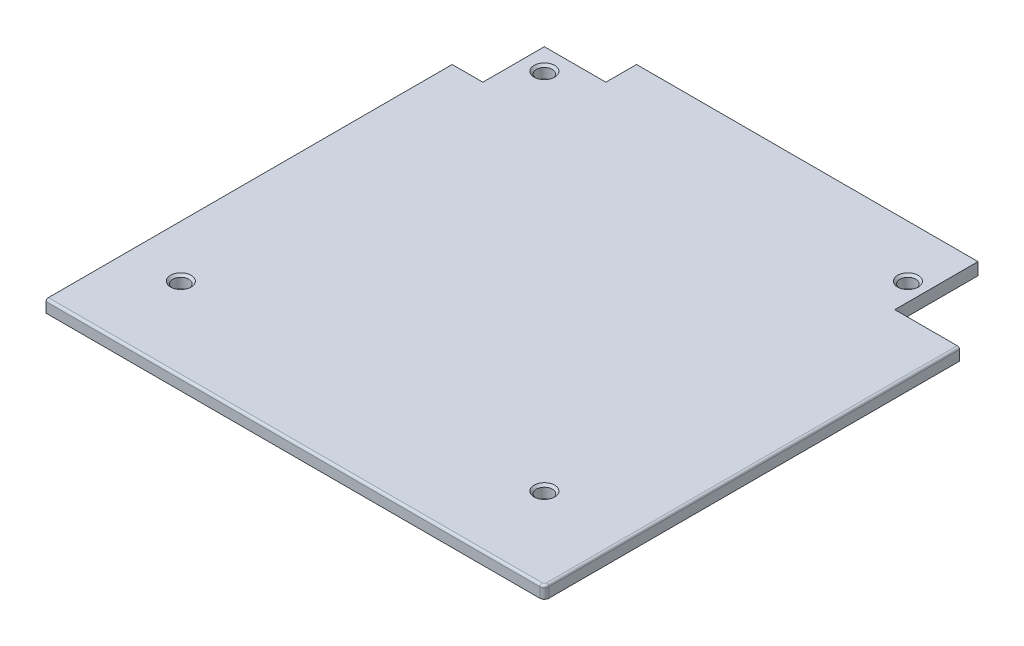
ISO-10303-21;
HEADER;
FILE_DESCRIPTION(('STEP AP214'),'2;1');
FILE_NAME('part.step','',(''),(''),'','','');
FILE_SCHEMA(('AUTOMOTIVE_DESIGN { 1 0 10303 214 1 1 1 1 }'));
ENDSEC;
DATA;
#1=APPLICATION_CONTEXT('core data for automotive mechanical design processes');
#2=APPLICATION_PROTOCOL_DEFINITION('international standard','automotive_design',2000,#1);
#3=PRODUCT_CONTEXT('',#1,'mechanical');
#4=PRODUCT('Part','Part','',(#3));
#5=PRODUCT_RELATED_PRODUCT_CATEGORY('part','',(#4));
#6=PRODUCT_DEFINITION_FORMATION('','',#4);
#7=PRODUCT_DEFINITION_CONTEXT('part definition',#1,'design');
#8=PRODUCT_DEFINITION('design','',#6,#7);
#9=PRODUCT_DEFINITION_SHAPE('','',#8);
#10=(LENGTH_UNIT() NAMED_UNIT(*) SI_UNIT(.MILLI.,.METRE.));
#11=(NAMED_UNIT(*) PLANE_ANGLE_UNIT() SI_UNIT($,.RADIAN.));
#12=(NAMED_UNIT(*) SI_UNIT($,.STERADIAN.) SOLID_ANGLE_UNIT());
#13=UNCERTAINTY_MEASURE_WITH_UNIT(LENGTH_MEASURE(1.E-05),#10,'distance_accuracy_value','');
#14=(GEOMETRIC_REPRESENTATION_CONTEXT(3) GLOBAL_UNCERTAINTY_ASSIGNED_CONTEXT((#13)) GLOBAL_UNIT_ASSIGNED_CONTEXT((#10,
#11,#12)) REPRESENTATION_CONTEXT('',''));
#15=CARTESIAN_POINT('',(0.,0.,0.));
#16=DIRECTION('',(0.,0.,1.));
#17=DIRECTION('',(1.,0.,0.));
#18=AXIS2_PLACEMENT_3D('',#15,#16,#17);
#19=CARTESIAN_POINT('',(0.,-2.,0.));
#20=DIRECTION('',(0.,1.,0.));
#21=DIRECTION('',(0.,0.,1.));
#22=AXIS2_PLACEMENT_3D('',#19,#20,#21);
#23=PLANE('',#22);
#24=CARTESIAN_POINT('',(59.25,-2.,59.25));
#25=DIRECTION('',(0.,1.,0.));
#26=DIRECTION('',(0.,0.,1.));
#27=AXIS2_PLACEMENT_3D('',#24,#25,#26);
#28=CIRCLE('',#27,2.6);
#29=CARTESIAN_POINT('',(59.25,-2.,61.85));
#30=VERTEX_POINT('',#29);
#31=EDGE_CURVE('E302',#30,#30,#28,.T.);
#32=ORIENTED_EDGE('',*,*,#31,.T.);
#33=EDGE_LOOP('',(#32));
#34=FACE_BOUND('',#33,.T.);
#35=CARTESIAN_POINT('',(-59.25,-2.,-59.25));
#36=DIRECTION('',(0.,1.,0.));
#37=DIRECTION('',(0.,0.,1.));
#38=AXIS2_PLACEMENT_3D('',#35,#36,#37);
#39=CIRCLE('',#38,2.6);
#40=CARTESIAN_POINT('',(-59.25,-2.,-56.65));
#41=VERTEX_POINT('',#40);
#42=EDGE_CURVE('E274',#41,#41,#39,.T.);
#43=ORIENTED_EDGE('',*,*,#42,.T.);
#44=EDGE_LOOP('',(#43));
#45=FACE_BOUND('',#44,.T.);
#46=CARTESIAN_POINT('',(84.75,-2.,84.75));
#47=DIRECTION('',(0.,1.,0.));
#48=DIRECTION('',(0.,0.,1.));
#49=AXIS2_PLACEMENT_3D('',#46,#47,#48);
#50=CIRCLE('',#49,1.5);
#51=CARTESIAN_POINT('',(86.25,-2.,84.75));
#52=VERTEX_POINT('',#51);
#53=CARTESIAN_POINT('',(84.75,-2.,86.25));
#54=VERTEX_POINT('',#53);
#55=EDGE_CURVE('E210',#52,#54,#50,.F.);
#56=ORIENTED_EDGE('',*,*,#55,.T.);
#57=DIRECTION('',(-1.,0.,0.));
#58=VECTOR('',#57,1.);
#59=CARTESIAN_POINT('',(0.,-2.,86.25));
#60=LINE('',#59,#58);
#61=CARTESIAN_POINT('',(-76.2,-2.,86.25));
#62=VERTEX_POINT('',#61);
#63=EDGE_CURVE('E187',#54,#62,#60,.T.);
#64=ORIENTED_EDGE('',*,*,#63,.T.);
#65=DIRECTION('',(0.,0.,-1.));
#66=VECTOR('',#65,1.);
#67=CARTESIAN_POINT('',(-76.2,-2.,0.));
#68=LINE('',#67,#66);
#69=CARTESIAN_POINT('',(-76.2,-2.,-46.15));
#70=VERTEX_POINT('',#69);
#71=EDGE_CURVE('E235',#62,#70,#68,.T.);
#72=ORIENTED_EDGE('',*,*,#71,.T.);
#73=DIRECTION('',(-1.,0.,0.));
#74=VECTOR('',#73,1.);
#75=CARTESIAN_POINT('',(0.,-2.,-46.15));
#76=LINE('',#75,#74);
#77=CARTESIAN_POINT('',(-66.2,-2.,-46.15));
#78=VERTEX_POINT('',#77);
#79=EDGE_CURVE('E232',#78,#70,#76,.T.);
#80=ORIENTED_EDGE('',*,*,#79,.F.);
#81=DIRECTION('',(0.,0.,-1.));
#82=VECTOR('',#81,1.);
#83=CARTESIAN_POINT('',(-66.2,-2.,0.));
#84=LINE('',#83,#82);
#85=CARTESIAN_POINT('',(-66.2,-2.,-66.2));
#86=VERTEX_POINT('',#85);
#87=EDGE_CURVE('E229',#78,#86,#84,.T.);
#88=ORIENTED_EDGE('',*,*,#87,.T.);
#89=DIRECTION('',(1.,0.,0.));
#90=VECTOR('',#89,1.);
#91=CARTESIAN_POINT('',(0.,-2.,-66.2));
#92=LINE('',#91,#90);
#93=CARTESIAN_POINT('',(-46.15,-2.,-66.2));
#94=VERTEX_POINT('',#93);
#95=EDGE_CURVE('E226',#86,#94,#92,.T.);
#96=ORIENTED_EDGE('',*,*,#95,.T.);
#97=DIRECTION('',(0.,0.,-1.));
#98=VECTOR('',#97,1.);
#99=CARTESIAN_POINT('',(-46.15,-2.,0.));
#100=LINE('',#99,#98);
#101=CARTESIAN_POINT('',(-46.15,-2.,-76.2));
#102=VERTEX_POINT('',#101);
#103=EDGE_CURVE('E223',#94,#102,#100,.T.);
#104=ORIENTED_EDGE('',*,*,#103,.T.);
#105=DIRECTION('',(1.,0.,0.));
#106=VECTOR('',#105,1.);
#107=CARTESIAN_POINT('',(0.,-2.,-76.2));
#108=LINE('',#107,#106);
#109=CARTESIAN_POINT('',(65.15,-2.,-76.2));
#110=VERTEX_POINT('',#109);
#111=EDGE_CURVE('E220',#102,#110,#108,.T.);
#112=ORIENTED_EDGE('',*,*,#111,.T.);
#113=DIRECTION('',(0.,0.,1.));
#114=VECTOR('',#113,1.);
#115=CARTESIAN_POINT('',(65.15,-2.,0.));
#116=LINE('',#115,#114);
#117=CARTESIAN_POINT('',(65.15,-2.,-49.08));
#118=VERTEX_POINT('',#117);
#119=EDGE_CURVE('E218',#110,#118,#116,.T.);
#120=ORIENTED_EDGE('',*,*,#119,.T.);
#121=DIRECTION('',(1.,0.,0.));
#122=VECTOR('',#121,1.);
#123=CARTESIAN_POINT('',(0.,-2.,-49.08));
#124=LINE('',#123,#122);
#125=CARTESIAN_POINT('',(86.25,-2.,-49.08));
#126=VERTEX_POINT('',#125);
#127=EDGE_CURVE('E171',#118,#126,#124,.T.);
#128=ORIENTED_EDGE('',*,*,#127,.T.);
#129=DIRECTION('',(0.,0.,1.));
#130=VECTOR('',#129,1.);
#131=CARTESIAN_POINT('',(86.25,-2.,0.));
#132=LINE('',#131,#130);
#133=EDGE_CURVE('E213',#126,#52,#132,.T.);
#134=ORIENTED_EDGE('',*,*,#133,.T.);
#135=EDGE_LOOP('',(#56,#64,#72,#80,#88,#96,#104,#112,#120,#128,#134));
#136=FACE_BOUND('',#135,.T.);
#137=CARTESIAN_POINT('',(-59.25,-2.,59.25));
#138=DIRECTION('',(0.,1.,0.));
#139=DIRECTION('',(0.,0.,1.));
#140=AXIS2_PLACEMENT_3D('',#137,#138,#139);
#141=CIRCLE('',#140,2.6);
#142=CARTESIAN_POINT('',(-59.25,-2.,61.85));
#143=VERTEX_POINT('',#142);
#144=EDGE_CURVE('E307',#143,#143,#141,.T.);
#145=ORIENTED_EDGE('',*,*,#144,.T.);
#146=EDGE_LOOP('',(#145));
#147=FACE_BOUND('',#146,.T.);
#148=CARTESIAN_POINT('',(59.25,-2.,-59.25));
#149=DIRECTION('',(0.,1.,0.));
#150=DIRECTION('',(0.,0.,1.));
#151=AXIS2_PLACEMENT_3D('',#148,#149,#150);
#152=CIRCLE('',#151,2.6);
#153=CARTESIAN_POINT('',(59.25,-2.,-56.65));
#154=VERTEX_POINT('',#153);
#155=EDGE_CURVE('E297',#154,#154,#152,.T.);
#156=ORIENTED_EDGE('',*,*,#155,.T.);
#157=EDGE_LOOP('',(#156));
#158=FACE_BOUND('',#157,.T.);
#159=ADVANCED_FACE('F69',(#34,#45,#136,#147,#158),#23,.F.);
#160=CARTESIAN_POINT('',(59.25,0.499999999999999,-59.25));
#161=DIRECTION('',(0.,1.,0.));
#162=DIRECTION('',(0.,0.,1.));
#163=AXIS2_PLACEMENT_3D('',#160,#161,#162);
#164=CONICAL_SURFACE('',#163,1.85,0.785398163397446);
#165=CARTESIAN_POINT('',(59.25,2.,-59.25));
#166=DIRECTION('',(0.,1.,0.));
#167=DIRECTION('',(0.,0.,1.));
#168=AXIS2_PLACEMENT_3D('',#165,#166,#167);
#169=CIRCLE('',#168,3.34999999999999);
#170=CARTESIAN_POINT('',(59.25,2.,-55.9));
#171=VERTEX_POINT('',#170);
#172=EDGE_CURVE('E266',#171,#171,#169,.F.);
#173=ORIENTED_EDGE('',*,*,#172,.F.);
#174=EDGE_LOOP('',(#173));
#175=FACE_BOUND('',#174,.T.);
#176=CARTESIAN_POINT('',(59.25,1.25,-59.25));
#177=DIRECTION('',(0.,1.,0.));
#178=DIRECTION('',(0.,0.,1.));
#179=AXIS2_PLACEMENT_3D('',#176,#177,#178);
#180=CIRCLE('',#179,2.6);
#181=CARTESIAN_POINT('',(59.25,1.25,-56.65));
#182=VERTEX_POINT('',#181);
#183=EDGE_CURVE('E214',#182,#182,#180,.F.);
#184=ORIENTED_EDGE('',*,*,#183,.T.);
#185=EDGE_LOOP('',(#184));
#186=FACE_BOUND('',#185,.T.);
#187=ADVANCED_FACE('F334',(#175,#186),#164,.F.);
#188=CARTESIAN_POINT('',(-59.25,0.499999999999999,59.25));
#189=DIRECTION('',(0.,1.,0.));
#190=DIRECTION('',(0.,0.,1.));
#191=AXIS2_PLACEMENT_3D('',#188,#189,#190);
#192=CONICAL_SURFACE('',#191,1.85,0.785398163397446);
#193=CARTESIAN_POINT('',(-59.25,2.,59.25));
#194=DIRECTION('',(0.,1.,0.));
#195=DIRECTION('',(0.,0.,1.));
#196=AXIS2_PLACEMENT_3D('',#193,#194,#195);
#197=CIRCLE('',#196,3.34999999999999);
#198=CARTESIAN_POINT('',(-59.25,2.,62.6));
#199=VERTEX_POINT('',#198);
#200=EDGE_CURVE('E263',#199,#199,#197,.F.);
#201=ORIENTED_EDGE('',*,*,#200,.F.);
#202=EDGE_LOOP('',(#201));
#203=FACE_BOUND('',#202,.T.);
#204=CARTESIAN_POINT('',(-59.25,1.25,59.25));
#205=DIRECTION('',(0.,1.,0.));
#206=DIRECTION('',(0.,0.,1.));
#207=AXIS2_PLACEMENT_3D('',#204,#205,#206);
#208=CIRCLE('',#207,2.6);
#209=CARTESIAN_POINT('',(-59.25,1.25,61.85));
#210=VERTEX_POINT('',#209);
#211=EDGE_CURVE('E277',#210,#210,#208,.F.);
#212=ORIENTED_EDGE('',*,*,#211,.T.);
#213=EDGE_LOOP('',(#212));
#214=FACE_BOUND('',#213,.T.);
#215=ADVANCED_FACE('F341',(#203,#214),#192,.F.);
#216=CARTESIAN_POINT('',(59.25,0.499999999999999,59.25));
#217=DIRECTION('',(0.,1.,0.));
#218=DIRECTION('',(0.,0.,1.));
#219=AXIS2_PLACEMENT_3D('',#216,#217,#218);
#220=CONICAL_SURFACE('',#219,1.85,0.785398163397446);
#221=CARTESIAN_POINT('',(59.25,2.,59.25));
#222=DIRECTION('',(0.,1.,0.));
#223=DIRECTION('',(0.,0.,1.));
#224=AXIS2_PLACEMENT_3D('',#221,#222,#223);
#225=CIRCLE('',#224,3.34999999999999);
#226=CARTESIAN_POINT('',(59.25,2.,62.6));
#227=VERTEX_POINT('',#226);
#228=EDGE_CURVE('E260',#227,#227,#225,.F.);
#229=ORIENTED_EDGE('',*,*,#228,.F.);
#230=EDGE_LOOP('',(#229));
#231=FACE_BOUND('',#230,.T.);
#232=CARTESIAN_POINT('',(59.25,1.25,59.25));
#233=DIRECTION('',(0.,1.,0.));
#234=DIRECTION('',(0.,0.,1.));
#235=AXIS2_PLACEMENT_3D('',#232,#233,#234);
#236=CIRCLE('',#235,2.6);
#237=CARTESIAN_POINT('',(59.25,1.25,61.85));
#238=VERTEX_POINT('',#237);
#239=EDGE_CURVE('E273',#238,#238,#236,.F.);
#240=ORIENTED_EDGE('',*,*,#239,.T.);
#241=EDGE_LOOP('',(#240));
#242=FACE_BOUND('',#241,.T.);
#243=ADVANCED_FACE('F394',(#231,#242),#220,.F.);
#244=CARTESIAN_POINT('',(-59.25,0.499999999999999,-59.25));
#245=DIRECTION('',(0.,1.,0.));
#246=DIRECTION('',(0.,0.,1.));
#247=AXIS2_PLACEMENT_3D('',#244,#245,#246);
#248=CONICAL_SURFACE('',#247,1.85,0.785398163397446);
#249=CARTESIAN_POINT('',(-59.25,2.,-59.25));
#250=DIRECTION('',(0.,1.,0.));
#251=DIRECTION('',(0.,0.,1.));
#252=AXIS2_PLACEMENT_3D('',#249,#250,#251);
#253=CIRCLE('',#252,3.34999999999999);
#254=CARTESIAN_POINT('',(-59.25,2.,-55.9));
#255=VERTEX_POINT('',#254);
#256=EDGE_CURVE('E257',#255,#255,#253,.F.);
#257=ORIENTED_EDGE('',*,*,#256,.F.);
#258=EDGE_LOOP('',(#257));
#259=FACE_BOUND('',#258,.T.);
#260=CARTESIAN_POINT('',(-59.25,1.25,-59.25));
#261=DIRECTION('',(0.,1.,0.));
#262=DIRECTION('',(0.,0.,1.));
#263=AXIS2_PLACEMENT_3D('',#260,#261,#262);
#264=CIRCLE('',#263,2.6);
#265=CARTESIAN_POINT('',(-59.25,1.25,-56.65));
#266=VERTEX_POINT('',#265);
#267=EDGE_CURVE('E270',#266,#266,#264,.F.);
#268=ORIENTED_EDGE('',*,*,#267,.T.);
#269=EDGE_LOOP('',(#268));
#270=FACE_BOUND('',#269,.T.);
#271=ADVANCED_FACE('F383',(#259,#270),#248,.F.);
#272=CARTESIAN_POINT('',(84.75,2.,84.75));
#273=DIRECTION('',(0.,-1.,0.));
#274=DIRECTION('',(0.,0.,-1.));
#275=AXIS2_PLACEMENT_3D('',#272,#273,#274);
#276=CYLINDRICAL_SURFACE('',#275,1.5);
#277=DIRECTION('',(0.,-1.,0.));
#278=VECTOR('',#277,1.);
#279=CARTESIAN_POINT('',(86.25,2.,84.75));
#280=LINE('',#279,#278);
#281=CARTESIAN_POINT('',(86.25,1.25,84.75));
#282=VERTEX_POINT('',#281);
#283=EDGE_CURVE('E255',#282,#52,#280,.T.);
#284=ORIENTED_EDGE('',*,*,#283,.F.);
#285=CARTESIAN_POINT('',(84.75,1.25,84.75));
#286=DIRECTION('',(0.,1.,0.));
#287=DIRECTION('',(0.,0.,1.));
#288=AXIS2_PLACEMENT_3D('',#285,#286,#287);
#289=CIRCLE('',#288,1.5);
#290=CARTESIAN_POINT('',(84.75,1.25,86.25));
#291=VERTEX_POINT('',#290);
#292=EDGE_CURVE('E93',#282,#291,#289,.F.);
#293=ORIENTED_EDGE('',*,*,#292,.T.);
#294=DIRECTION('',(0.,-1.,0.));
#295=VECTOR('',#294,1.);
#296=CARTESIAN_POINT('',(84.75,2.,86.25));
#297=LINE('',#296,#295);
#298=EDGE_CURVE('E209',#291,#54,#297,.T.);
#299=ORIENTED_EDGE('',*,*,#298,.T.);
#300=ORIENTED_EDGE('',*,*,#55,.F.);
#301=EDGE_LOOP('',(#284,#293,#299,#300));
#302=FACE_BOUND('',#301,.T.);
#303=ADVANCED_FACE('F380',(#302),#276,.T.);
#304=CARTESIAN_POINT('',(86.25,2.,0.));
#305=DIRECTION('',(1.,0.,0.));
#306=DIRECTION('',(0.,0.,-1.));
#307=AXIS2_PLACEMENT_3D('',#304,#305,#306);
#308=PLANE('',#307);
#309=DIRECTION('',(0.,-1.,0.));
#310=VECTOR('',#309,1.);
#311=CARTESIAN_POINT('',(86.25,2.,-49.08));
#312=LINE('',#311,#310);
#313=CARTESIAN_POINT('',(86.25,1.25,-49.08));
#314=VERTEX_POINT('',#313);
#315=EDGE_CURVE('E176',#314,#126,#312,.T.);
#316=ORIENTED_EDGE('',*,*,#315,.F.);
#317=DIRECTION('',(0.,0.,1.));
#318=VECTOR('',#317,1.);
#319=CARTESIAN_POINT('',(86.25,1.25,0.));
#320=LINE('',#319,#318);
#321=EDGE_CURVE('E269',#314,#282,#320,.T.);
#322=ORIENTED_EDGE('',*,*,#321,.T.);
#323=ORIENTED_EDGE('',*,*,#283,.T.);
#324=ORIENTED_EDGE('',*,*,#133,.F.);
#325=EDGE_LOOP('',(#316,#322,#323,#324));
#326=FACE_BOUND('',#325,.T.);
#327=ADVANCED_FACE('F377',(#326),#308,.T.);
#328=CARTESIAN_POINT('',(0.,2.,-49.08));
#329=DIRECTION('',(0.,0.,-1.));
#330=DIRECTION('',(-1.,0.,0.));
#331=AXIS2_PLACEMENT_3D('',#328,#329,#330);
#332=PLANE('',#331);
#333=DIRECTION('',(1.,0.,0.));
#334=VECTOR('',#333,1.);
#335=CARTESIAN_POINT('',(0.,2.,-49.08));
#336=LINE('',#335,#334);
#337=CARTESIAN_POINT('',(65.15,2.,-49.08));
#338=VERTEX_POINT('',#337);
#339=CARTESIAN_POINT('',(85.5,2.,-49.08));
#340=VERTEX_POINT('',#339);
#341=EDGE_CURVE('E168',#338,#340,#336,.T.);
#342=ORIENTED_EDGE('',*,*,#341,.T.);
#343=CARTESIAN_POINT('',(85.5,1.25,-49.08));
#344=DIRECTION('',(0.,0.,-1.));
#345=DIRECTION('',(-1.,0.,0.));
#346=AXIS2_PLACEMENT_3D('',#343,#344,#345);
#347=CIRCLE('',#346,0.75);
#348=EDGE_CURVE('E289',#340,#314,#347,.T.);
#349=ORIENTED_EDGE('',*,*,#348,.T.);
#350=ORIENTED_EDGE('',*,*,#315,.T.);
#351=ORIENTED_EDGE('',*,*,#127,.F.);
#352=DIRECTION('',(0.,-1.,0.));
#353=VECTOR('',#352,1.);
#354=CARTESIAN_POINT('',(65.15,2.,-49.08));
#355=LINE('',#354,#353);
#356=EDGE_CURVE('E165',#338,#118,#355,.T.);
#357=ORIENTED_EDGE('',*,*,#356,.F.);
#358=EDGE_LOOP('',(#342,#349,#350,#351,#357));
#359=FACE_BOUND('',#358,.T.);
#360=ADVANCED_FACE('F167',(#359),#332,.T.);
#361=CARTESIAN_POINT('',(65.15,2.,0.));
#362=DIRECTION('',(1.,0.,0.));
#363=DIRECTION('',(0.,0.,-1.));
#364=AXIS2_PLACEMENT_3D('',#361,#362,#363);
#365=PLANE('',#364);
#366=ORIENTED_EDGE('',*,*,#119,.F.);
#367=DIRECTION('',(0.,-1.,0.));
#368=VECTOR('',#367,1.);
#369=CARTESIAN_POINT('',(65.15,2.,-76.2));
#370=LINE('',#369,#368);
#371=CARTESIAN_POINT('',(65.15,2.,-76.2));
#372=VERTEX_POINT('',#371);
#373=EDGE_CURVE('E177',#372,#110,#370,.T.);
#374=ORIENTED_EDGE('',*,*,#373,.F.);
#375=DIRECTION('',(0.,0.,1.));
#376=VECTOR('',#375,1.);
#377=CARTESIAN_POINT('',(65.15,2.,0.));
#378=LINE('',#377,#376);
#379=EDGE_CURVE('E183',#372,#338,#378,.T.);
#380=ORIENTED_EDGE('',*,*,#379,.T.);
#381=ORIENTED_EDGE('',*,*,#356,.T.);
#382=EDGE_LOOP('',(#366,#374,#380,#381));
#383=FACE_BOUND('',#382,.T.);
#384=ADVANCED_FACE('F189',(#383),#365,.T.);
#385=CARTESIAN_POINT('',(0.,2.,-76.2));
#386=DIRECTION('',(0.,0.,-1.));
#387=DIRECTION('',(-1.,0.,0.));
#388=AXIS2_PLACEMENT_3D('',#385,#386,#387);
#389=PLANE('',#388);
#390=ORIENTED_EDGE('',*,*,#111,.F.);
#391=DIRECTION('',(0.,-1.,0.));
#392=VECTOR('',#391,1.);
#393=CARTESIAN_POINT('',(-46.15,2.,-76.2));
#394=LINE('',#393,#392);
#395=CARTESIAN_POINT('',(-46.15,2.,-76.2));
#396=VERTEX_POINT('',#395);
#397=EDGE_CURVE('E251',#396,#102,#394,.T.);
#398=ORIENTED_EDGE('',*,*,#397,.F.);
#399=DIRECTION('',(1.,0.,0.));
#400=VECTOR('',#399,1.);
#401=CARTESIAN_POINT('',(0.,2.,-76.2));
#402=LINE('',#401,#400);
#403=EDGE_CURVE('E190',#396,#372,#402,.T.);
#404=ORIENTED_EDGE('',*,*,#403,.T.);
#405=ORIENTED_EDGE('',*,*,#373,.T.);
#406=EDGE_LOOP('',(#390,#398,#404,#405));
#407=FACE_BOUND('',#406,.T.);
#408=ADVANCED_FACE('F368',(#407),#389,.T.);
#409=CARTESIAN_POINT('',(-46.15,2.,0.));
#410=DIRECTION('',(-1.,0.,0.));
#411=DIRECTION('',(0.,0.,1.));
#412=AXIS2_PLACEMENT_3D('',#409,#410,#411);
#413=PLANE('',#412);
#414=ORIENTED_EDGE('',*,*,#103,.F.);
#415=DIRECTION('',(0.,-1.,0.));
#416=VECTOR('',#415,1.);
#417=CARTESIAN_POINT('',(-46.15,2.,-66.2));
#418=LINE('',#417,#416);
#419=CARTESIAN_POINT('',(-46.15,2.,-66.2));
#420=VERTEX_POINT('',#419);
#421=EDGE_CURVE('E249',#420,#94,#418,.T.);
#422=ORIENTED_EDGE('',*,*,#421,.F.);
#423=DIRECTION('',(0.,0.,-1.));
#424=VECTOR('',#423,1.);
#425=CARTESIAN_POINT('',(-46.15,2.,0.));
#426=LINE('',#425,#424);
#427=EDGE_CURVE('E192',#420,#396,#426,.T.);
#428=ORIENTED_EDGE('',*,*,#427,.T.);
#429=ORIENTED_EDGE('',*,*,#397,.T.);
#430=EDGE_LOOP('',(#414,#422,#428,#429));
#431=FACE_BOUND('',#430,.T.);
#432=ADVANCED_FACE('F364',(#431),#413,.T.);
#433=CARTESIAN_POINT('',(0.,2.,-66.2));
#434=DIRECTION('',(0.,0.,-1.));
#435=DIRECTION('',(-1.,0.,0.));
#436=AXIS2_PLACEMENT_3D('',#433,#434,#435);
#437=PLANE('',#436);
#438=ORIENTED_EDGE('',*,*,#95,.F.);
#439=DIRECTION('',(0.,-1.,0.));
#440=VECTOR('',#439,1.);
#441=CARTESIAN_POINT('',(-66.2,2.,-66.2));
#442=LINE('',#441,#440);
#443=CARTESIAN_POINT('',(-66.2,2.,-66.2));
#444=VERTEX_POINT('',#443);
#445=EDGE_CURVE('E247',#444,#86,#442,.T.);
#446=ORIENTED_EDGE('',*,*,#445,.F.);
#447=DIRECTION('',(1.,0.,0.));
#448=VECTOR('',#447,1.);
#449=CARTESIAN_POINT('',(0.,2.,-66.2));
#450=LINE('',#449,#448);
#451=EDGE_CURVE('E198',#444,#420,#450,.T.);
#452=ORIENTED_EDGE('',*,*,#451,.T.);
#453=ORIENTED_EDGE('',*,*,#421,.T.);
#454=EDGE_LOOP('',(#438,#446,#452,#453));
#455=FACE_BOUND('',#454,.T.);
#456=ADVANCED_FACE('F360',(#455),#437,.T.);
#457=CARTESIAN_POINT('',(-66.2,2.,0.));
#458=DIRECTION('',(-1.,0.,0.));
#459=DIRECTION('',(0.,0.,1.));
#460=AXIS2_PLACEMENT_3D('',#457,#458,#459);
#461=PLANE('',#460);
#462=ORIENTED_EDGE('',*,*,#87,.F.);
#463=DIRECTION('',(0.,-1.,0.));
#464=VECTOR('',#463,1.);
#465=CARTESIAN_POINT('',(-66.2,2.,-46.15));
#466=LINE('',#465,#464);
#467=CARTESIAN_POINT('',(-66.2,2.,-46.15));
#468=VERTEX_POINT('',#467);
#469=EDGE_CURVE('E245',#468,#78,#466,.T.);
#470=ORIENTED_EDGE('',*,*,#469,.F.);
#471=DIRECTION('',(0.,0.,-1.));
#472=VECTOR('',#471,1.);
#473=CARTESIAN_POINT('',(-66.2,2.,0.));
#474=LINE('',#473,#472);
#475=EDGE_CURVE('E201',#468,#444,#474,.T.);
#476=ORIENTED_EDGE('',*,*,#475,.T.);
#477=ORIENTED_EDGE('',*,*,#445,.T.);
#478=EDGE_LOOP('',(#462,#470,#476,#477));
#479=FACE_BOUND('',#478,.T.);
#480=ADVANCED_FACE('F356',(#479),#461,.T.);
#481=CARTESIAN_POINT('',(0.,2.,-46.15));
#482=DIRECTION('',(0.,0.,1.));
#483=DIRECTION('',(1.,0.,0.));
#484=AXIS2_PLACEMENT_3D('',#481,#482,#483);
#485=PLANE('',#484);
#486=ORIENTED_EDGE('',*,*,#79,.T.);
#487=DIRECTION('',(0.,-1.,0.));
#488=VECTOR('',#487,1.);
#489=CARTESIAN_POINT('',(-76.2,2.,-46.15));
#490=LINE('',#489,#488);
#491=CARTESIAN_POINT('',(-76.2,2.,-46.15));
#492=VERTEX_POINT('',#491);
#493=EDGE_CURVE('E243',#492,#70,#490,.T.);
#494=ORIENTED_EDGE('',*,*,#493,.F.);
#495=DIRECTION('',(-1.,0.,0.));
#496=VECTOR('',#495,1.);
#497=CARTESIAN_POINT('',(0.,2.,-46.15));
#498=LINE('',#497,#496);
#499=EDGE_CURVE('E204',#468,#492,#498,.T.);
#500=ORIENTED_EDGE('',*,*,#499,.F.);
#501=ORIENTED_EDGE('',*,*,#469,.T.);
#502=EDGE_LOOP('',(#486,#494,#500,#501));
#503=FACE_BOUND('',#502,.T.);
#504=ADVANCED_FACE('F353',(#503),#485,.F.);
#505=CARTESIAN_POINT('',(-76.2,2.,0.));
#506=DIRECTION('',(-1.,0.,0.));
#507=DIRECTION('',(0.,0.,1.));
#508=AXIS2_PLACEMENT_3D('',#505,#506,#507);
#509=PLANE('',#508);
#510=DIRECTION('',(0.,-1.,0.));
#511=VECTOR('',#510,1.);
#512=CARTESIAN_POINT('',(-76.2,2.,86.25));
#513=LINE('',#512,#511);
#514=CARTESIAN_POINT('',(-76.2,1.25,86.25));
#515=VERTEX_POINT('',#514);
#516=EDGE_CURVE('E241',#515,#62,#513,.T.);
#517=ORIENTED_EDGE('',*,*,#516,.F.);
#518=CARTESIAN_POINT('',(-76.2,1.25,85.5));
#519=DIRECTION('',(-1.,0.,0.));
#520=DIRECTION('',(0.,0.,1.));
#521=AXIS2_PLACEMENT_3D('',#518,#519,#520);
#522=CIRCLE('',#521,0.75);
#523=CARTESIAN_POINT('',(-76.2,2.,85.5));
#524=VERTEX_POINT('',#523);
#525=EDGE_CURVE('E12',#515,#524,#522,.T.);
#526=ORIENTED_EDGE('',*,*,#525,.T.);
#527=DIRECTION('',(0.,0.,-1.));
#528=VECTOR('',#527,1.);
#529=CARTESIAN_POINT('',(-76.2,2.,0.));
#530=LINE('',#529,#528);
#531=EDGE_CURVE('E207',#524,#492,#530,.T.);
#532=ORIENTED_EDGE('',*,*,#531,.T.);
#533=ORIENTED_EDGE('',*,*,#493,.T.);
#534=ORIENTED_EDGE('',*,*,#71,.F.);
#535=EDGE_LOOP('',(#517,#526,#532,#533,#534));
#536=FACE_BOUND('',#535,.T.);
#537=ADVANCED_FACE('F350',(#536),#509,.T.);
#538=CARTESIAN_POINT('',(0.,2.,86.25));
#539=DIRECTION('',(0.,0.,1.));
#540=DIRECTION('',(1.,0.,0.));
#541=AXIS2_PLACEMENT_3D('',#538,#539,#540);
#542=PLANE('',#541);
#543=ORIENTED_EDGE('',*,*,#298,.F.);
#544=DIRECTION('',(-1.,0.,0.));
#545=VECTOR('',#544,1.);
#546=CARTESIAN_POINT('',(0.,1.25,86.25));
#547=LINE('',#546,#545);
#548=EDGE_CURVE('E78',#291,#515,#547,.T.);
#549=ORIENTED_EDGE('',*,*,#548,.T.);
#550=ORIENTED_EDGE('',*,*,#516,.T.);
#551=ORIENTED_EDGE('',*,*,#63,.F.);
#552=EDGE_LOOP('',(#543,#549,#550,#551));
#553=FACE_BOUND('',#552,.T.);
#554=ADVANCED_FACE('F347',(#553),#542,.T.);
#555=CARTESIAN_POINT('',(0.,2.,0.));
#556=DIRECTION('',(0.,1.,0.));
#557=DIRECTION('',(0.,0.,1.));
#558=AXIS2_PLACEMENT_3D('',#555,#556,#557);
#559=PLANE('',#558);
#560=ORIENTED_EDGE('',*,*,#172,.T.);
#561=EDGE_LOOP('',(#560));
#562=FACE_BOUND('',#561,.T.);
#563=ORIENTED_EDGE('',*,*,#200,.T.);
#564=EDGE_LOOP('',(#563));
#565=FACE_BOUND('',#564,.T.);
#566=ORIENTED_EDGE('',*,*,#228,.T.);
#567=EDGE_LOOP('',(#566));
#568=FACE_BOUND('',#567,.T.);
#569=ORIENTED_EDGE('',*,*,#256,.T.);
#570=EDGE_LOOP('',(#569));
#571=FACE_BOUND('',#570,.T.);
#572=CARTESIAN_POINT('',(84.75,2.,84.75));
#573=DIRECTION('',(0.,1.,0.));
#574=DIRECTION('',(0.,0.,1.));
#575=AXIS2_PLACEMENT_3D('',#572,#573,#574);
#576=CIRCLE('',#575,0.750000000000001);
#577=CARTESIAN_POINT('',(84.75,2.,85.5));
#578=VERTEX_POINT('',#577);
#579=CARTESIAN_POINT('',(85.5,2.,84.75));
#580=VERTEX_POINT('',#579);
#581=EDGE_CURVE('E286',#578,#580,#576,.T.);
#582=ORIENTED_EDGE('',*,*,#581,.T.);
#583=DIRECTION('',(0.,0.,1.));
#584=VECTOR('',#583,1.);
#585=CARTESIAN_POINT('',(85.5,2.,0.));
#586=LINE('',#585,#584);
#587=EDGE_CURVE('E186',#580,#340,#586,.F.);
#588=ORIENTED_EDGE('',*,*,#587,.T.);
#589=ORIENTED_EDGE('',*,*,#341,.F.);
#590=ORIENTED_EDGE('',*,*,#379,.F.);
#591=ORIENTED_EDGE('',*,*,#403,.F.);
#592=ORIENTED_EDGE('',*,*,#427,.F.);
#593=ORIENTED_EDGE('',*,*,#451,.F.);
#594=ORIENTED_EDGE('',*,*,#475,.F.);
#595=ORIENTED_EDGE('',*,*,#499,.T.);
#596=ORIENTED_EDGE('',*,*,#531,.F.);
#597=DIRECTION('',(-1.,0.,0.));
#598=VECTOR('',#597,1.);
#599=CARTESIAN_POINT('',(0.,2.,85.5));
#600=LINE('',#599,#598);
#601=EDGE_CURVE('E284',#524,#578,#600,.F.);
#602=ORIENTED_EDGE('',*,*,#601,.T.);
#603=EDGE_LOOP('',(#582,#588,#589,#590,#591,#592,#593,#594,#595,#596,#602));
#604=FACE_BOUND('',#603,.T.);
#605=ADVANCED_FACE('F181',(#562,#565,#568,#571,#604),#559,.T.);
#606=CARTESIAN_POINT('',(-59.25,9.35391052434009,-59.25));
#607=DIRECTION('',(0.,-1.,0.));
#608=DIRECTION('',(0.,0.,-1.));
#609=AXIS2_PLACEMENT_3D('',#606,#607,#608);
#610=CYLINDRICAL_SURFACE('',#609,2.6);
#611=ORIENTED_EDGE('',*,*,#267,.F.);
#612=EDGE_LOOP('',(#611));
#613=FACE_BOUND('',#612,.T.);
#614=ORIENTED_EDGE('',*,*,#42,.F.);
#615=EDGE_LOOP('',(#614));
#616=FACE_BOUND('',#615,.T.);
#617=ADVANCED_FACE('F329',(#613,#616),#610,.F.);
#618=CARTESIAN_POINT('',(59.25,9.35391052434009,59.25));
#619=DIRECTION('',(0.,-1.,0.));
#620=DIRECTION('',(0.,0.,-1.));
#621=AXIS2_PLACEMENT_3D('',#618,#619,#620);
#622=CYLINDRICAL_SURFACE('',#621,2.6);
#623=ORIENTED_EDGE('',*,*,#239,.F.);
#624=EDGE_LOOP('',(#623));
#625=FACE_BOUND('',#624,.T.);
#626=ORIENTED_EDGE('',*,*,#31,.F.);
#627=EDGE_LOOP('',(#626));
#628=FACE_BOUND('',#627,.T.);
#629=ADVANCED_FACE('F320',(#625,#628),#622,.F.);
#630=CARTESIAN_POINT('',(-59.25,9.35391052434009,59.25));
#631=DIRECTION('',(0.,-1.,0.));
#632=DIRECTION('',(0.,0.,-1.));
#633=AXIS2_PLACEMENT_3D('',#630,#631,#632);
#634=CYLINDRICAL_SURFACE('',#633,2.6);
#635=ORIENTED_EDGE('',*,*,#211,.F.);
#636=EDGE_LOOP('',(#635));
#637=FACE_BOUND('',#636,.T.);
#638=ORIENTED_EDGE('',*,*,#144,.F.);
#639=EDGE_LOOP('',(#638));
#640=FACE_BOUND('',#639,.T.);
#641=ADVANCED_FACE('F317',(#637,#640),#634,.F.);
#642=CARTESIAN_POINT('',(59.25,9.35391052434009,-59.25));
#643=DIRECTION('',(0.,-1.,0.));
#644=DIRECTION('',(0.,0.,-1.));
#645=AXIS2_PLACEMENT_3D('',#642,#643,#644);
#646=CYLINDRICAL_SURFACE('',#645,2.6);
#647=ORIENTED_EDGE('',*,*,#183,.F.);
#648=EDGE_LOOP('',(#647));
#649=FACE_BOUND('',#648,.T.);
#650=ORIENTED_EDGE('',*,*,#155,.F.);
#651=EDGE_LOOP('',(#650));
#652=FACE_BOUND('',#651,.T.);
#653=ADVANCED_FACE('F319',(#649,#652),#646,.F.);
#654=CARTESIAN_POINT('',(0.,1.25,85.5));
#655=DIRECTION('',(-1.,0.,0.));
#656=DIRECTION('',(0.,0.,1.));
#657=AXIS2_PLACEMENT_3D('',#654,#655,#656);
#658=CYLINDRICAL_SURFACE('',#657,0.75);
#659=ORIENTED_EDGE('',*,*,#525,.F.);
#660=ORIENTED_EDGE('',*,*,#548,.F.);
#661=CARTESIAN_POINT('',(84.75,1.25,85.5));
#662=DIRECTION('',(1.,0.,0.));
#663=DIRECTION('',(0.,0.,-1.));
#664=AXIS2_PLACEMENT_3D('',#661,#662,#663);
#665=CIRCLE('',#664,0.75);
#666=EDGE_CURVE('E73',#578,#291,#665,.T.);
#667=ORIENTED_EDGE('',*,*,#666,.F.);
#668=ORIENTED_EDGE('',*,*,#601,.F.);
#669=EDGE_LOOP('',(#659,#660,#667,#668));
#670=FACE_BOUND('',#669,.T.);
#671=ADVANCED_FACE('F71',(#670),#658,.T.);
#672=CARTESIAN_POINT('',(84.75,1.25,84.75));
#673=DIRECTION('',(0.,1.,0.));
#674=DIRECTION('',(0.,0.,1.));
#675=AXIS2_PLACEMENT_3D('',#672,#673,#674);
#676=TOROIDAL_SURFACE('',#675,0.750000000000001,0.75);
#677=ORIENTED_EDGE('',*,*,#666,.T.);
#678=ORIENTED_EDGE('',*,*,#292,.F.);
#679=CARTESIAN_POINT('',(85.5,1.25,84.75));
#680=DIRECTION('',(0.,0.,-1.));
#681=DIRECTION('',(-1.,0.,0.));
#682=AXIS2_PLACEMENT_3D('',#679,#680,#681);
#683=CIRCLE('',#682,0.75);
#684=EDGE_CURVE('E292',#580,#282,#683,.T.);
#685=ORIENTED_EDGE('',*,*,#684,.F.);
#686=ORIENTED_EDGE('',*,*,#581,.F.);
#687=EDGE_LOOP('',(#677,#678,#685,#686));
#688=FACE_BOUND('',#687,.T.);
#689=ADVANCED_FACE('F409',(#688),#676,.T.);
#690=CARTESIAN_POINT('',(85.5,1.25,0.));
#691=DIRECTION('',(0.,0.,1.));
#692=DIRECTION('',(1.,0.,0.));
#693=AXIS2_PLACEMENT_3D('',#690,#691,#692);
#694=CYLINDRICAL_SURFACE('',#693,0.75);
#695=ORIENTED_EDGE('',*,*,#348,.F.);
#696=ORIENTED_EDGE('',*,*,#587,.F.);
#697=ORIENTED_EDGE('',*,*,#684,.T.);
#698=ORIENTED_EDGE('',*,*,#321,.F.);
#699=EDGE_LOOP('',(#695,#696,#697,#698));
#700=FACE_BOUND('',#699,.T.);
#701=ADVANCED_FACE('F407',(#700),#694,.T.);
#702=CLOSED_SHELL('',(#159,#187,#215,#243,#271,#303,#327,#360,#384,#408,#432,#456,#480,#504,
#537,#554,#605,#617,#629,#641,#653,#671,#689,#701));
#703=MANIFOLD_SOLID_BREP('B2',#702);
#704=ADVANCED_BREP_SHAPE_REPRESENTATION('',(#18,#703),#14);
#705=SHAPE_DEFINITION_REPRESENTATION(#9,#704);
ENDSEC;
END-ISO-10303-21;
